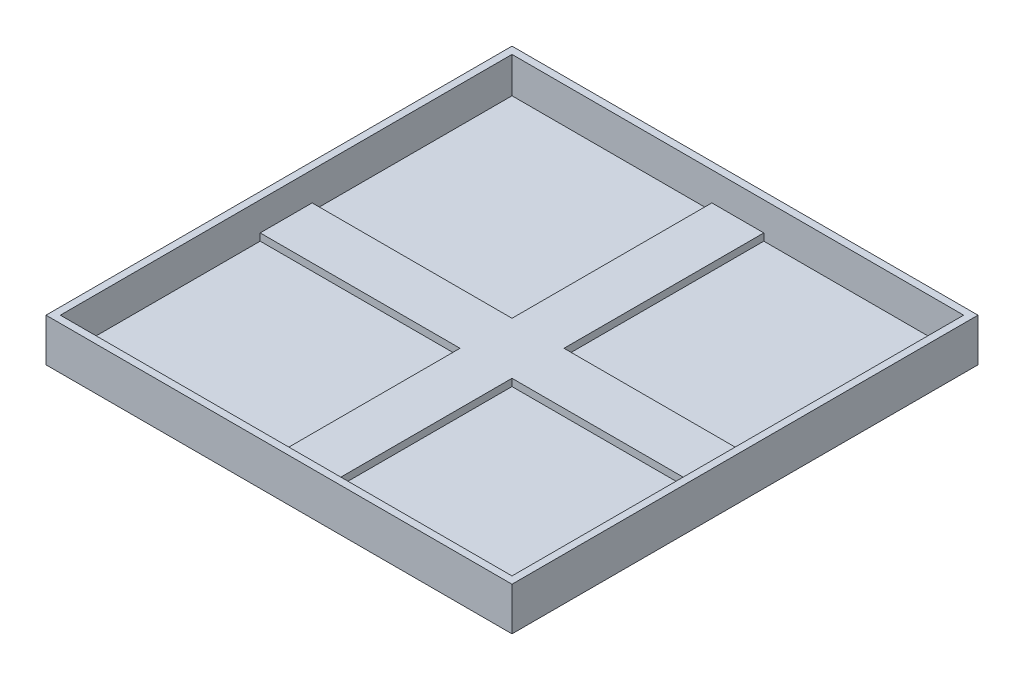
ISO-10303-21;
HEADER;
FILE_DESCRIPTION(('STEP AP214'),'2;1');
FILE_NAME('part.step','',(''),(''),'','','');
FILE_SCHEMA(('AUTOMOTIVE_DESIGN { 1 0 10303 214 1 1 1 1 }'));
ENDSEC;
DATA;
#1=APPLICATION_CONTEXT('core data for automotive mechanical design processes');
#2=APPLICATION_PROTOCOL_DEFINITION('international standard','automotive_design',2000,#1);
#3=PRODUCT_CONTEXT('',#1,'mechanical');
#4=PRODUCT('Part','Part','',(#3));
#5=PRODUCT_RELATED_PRODUCT_CATEGORY('part','',(#4));
#6=PRODUCT_DEFINITION_FORMATION('','',#4);
#7=PRODUCT_DEFINITION_CONTEXT('part definition',#1,'design');
#8=PRODUCT_DEFINITION('design','',#6,#7);
#9=PRODUCT_DEFINITION_SHAPE('','',#8);
#10=(LENGTH_UNIT() NAMED_UNIT(*) SI_UNIT(.MILLI.,.METRE.));
#11=(NAMED_UNIT(*) PLANE_ANGLE_UNIT() SI_UNIT($,.RADIAN.));
#12=(NAMED_UNIT(*) SI_UNIT($,.STERADIAN.) SOLID_ANGLE_UNIT());
#13=UNCERTAINTY_MEASURE_WITH_UNIT(LENGTH_MEASURE(1.E-05),#10,'distance_accuracy_value','');
#14=(GEOMETRIC_REPRESENTATION_CONTEXT(3) GLOBAL_UNCERTAINTY_ASSIGNED_CONTEXT((#13)) GLOBAL_UNIT_ASSIGNED_CONTEXT((#10,
#11,#12)) REPRESENTATION_CONTEXT('',''));
#15=CARTESIAN_POINT('',(0.,0.,0.));
#16=DIRECTION('',(0.,0.,1.));
#17=DIRECTION('',(1.,0.,0.));
#18=AXIS2_PLACEMENT_3D('',#15,#16,#17);
#19=CARTESIAN_POINT('',(0.,4.,0.));
#20=DIRECTION('',(0.,1.,0.));
#21=DIRECTION('',(0.,0.,1.));
#22=AXIS2_PLACEMENT_3D('',#19,#20,#21);
#23=PLANE('',#22);
#24=DIRECTION('',(0.,0.,1.));
#25=VECTOR('',#24,1.);
#26=CARTESIAN_POINT('',(126.,4.,0.));
#27=LINE('',#26,#25);
#28=CARTESIAN_POINT('',(126.,4.,14.5));
#29=VERTEX_POINT('',#28);
#30=CARTESIAN_POINT('',(126.,4.,126.));
#31=VERTEX_POINT('',#30);
#32=EDGE_CURVE('E53',#29,#31,#27,.T.);
#33=ORIENTED_EDGE('',*,*,#32,.F.);
#34=DIRECTION('',(-1.,0.,0.));
#35=VECTOR('',#34,1.);
#36=CARTESIAN_POINT('',(0.,4.,14.5));
#37=LINE('',#36,#35);
#38=CARTESIAN_POINT('',(14.5,4.,14.5));
#39=VERTEX_POINT('',#38);
#40=EDGE_CURVE('E168',#29,#39,#37,.T.);
#41=ORIENTED_EDGE('',*,*,#40,.T.);
#42=DIRECTION('',(0.,0.,1.));
#43=VECTOR('',#42,1.);
#44=CARTESIAN_POINT('',(14.5,4.,0.));
#45=LINE('',#44,#43);
#46=CARTESIAN_POINT('',(14.5,4.,126.));
#47=VERTEX_POINT('',#46);
#48=EDGE_CURVE('E165',#39,#47,#45,.T.);
#49=ORIENTED_EDGE('',*,*,#48,.T.);
#50=DIRECTION('',(-1.,0.,0.));
#51=VECTOR('',#50,1.);
#52=CARTESIAN_POINT('',(0.,4.,126.));
#53=LINE('',#52,#51);
#54=EDGE_CURVE('E203',#31,#47,#53,.T.);
#55=ORIENTED_EDGE('',*,*,#54,.F.);
#56=EDGE_LOOP('',(#33,#41,#49,#55));
#57=FACE_BOUND('',#56,.T.);
#58=ADVANCED_FACE('F45',(#57),#23,.T.);
#59=DIRECTION('',(0.,0.,1.));
#60=VECTOR('',#59,1.);
#61=CARTESIAN_POINT('',(-14.5,4.,0.));
#62=LINE('',#61,#60);
#63=CARTESIAN_POINT('',(-14.5,4.,14.5));
#64=VERTEX_POINT('',#63);
#65=CARTESIAN_POINT('',(-14.5,4.,126.));
#66=VERTEX_POINT('',#65);
#67=EDGE_CURVE('E162',#64,#66,#62,.T.);
#68=ORIENTED_EDGE('',*,*,#67,.F.);
#69=DIRECTION('',(-1.,0.,0.));
#70=VECTOR('',#69,1.);
#71=CARTESIAN_POINT('',(0.,4.,14.5));
#72=LINE('',#71,#70);
#73=CARTESIAN_POINT('',(-126.,4.,14.5));
#74=VERTEX_POINT('',#73);
#75=EDGE_CURVE('E159',#64,#74,#72,.T.);
#76=ORIENTED_EDGE('',*,*,#75,.T.);
#77=DIRECTION('',(0.,0.,1.));
#78=VECTOR('',#77,1.);
#79=CARTESIAN_POINT('',(-126.,4.,0.));
#80=LINE('',#79,#78);
#81=CARTESIAN_POINT('',(-126.,4.,126.));
#82=VERTEX_POINT('',#81);
#83=EDGE_CURVE('E199',#74,#82,#80,.T.);
#84=ORIENTED_EDGE('',*,*,#83,.T.);
#85=EDGE_CURVE('E202',#66,#82,#53,.T.);
#86=ORIENTED_EDGE('',*,*,#85,.F.);
#87=EDGE_LOOP('',(#68,#76,#84,#86));
#88=FACE_BOUND('',#87,.T.);
#89=ADVANCED_FACE('F245',(#88),#23,.T.);
#90=DIRECTION('',(-1.,0.,0.));
#91=VECTOR('',#90,1.);
#92=CARTESIAN_POINT('',(0.,4.,-14.5));
#93=LINE('',#92,#91);
#94=CARTESIAN_POINT('',(-14.5,4.,-14.5));
#95=VERTEX_POINT('',#94);
#96=CARTESIAN_POINT('',(-126.,4.,-14.5));
#97=VERTEX_POINT('',#96);
#98=EDGE_CURVE('E157',#95,#97,#93,.T.);
#99=ORIENTED_EDGE('',*,*,#98,.F.);
#100=DIRECTION('',(0.,0.,1.));
#101=VECTOR('',#100,1.);
#102=CARTESIAN_POINT('',(-14.5,4.,0.));
#103=LINE('',#102,#101);
#104=CARTESIAN_POINT('',(-14.5,4.,-126.));
#105=VERTEX_POINT('',#104);
#106=EDGE_CURVE('E120',#105,#95,#103,.T.);
#107=ORIENTED_EDGE('',*,*,#106,.F.);
#108=DIRECTION('',(-1.,0.,0.));
#109=VECTOR('',#108,1.);
#110=CARTESIAN_POINT('',(0.,4.,-126.));
#111=LINE('',#110,#109);
#112=CARTESIAN_POINT('',(-126.,4.,-126.));
#113=VERTEX_POINT('',#112);
#114=EDGE_CURVE('E195',#105,#113,#111,.T.);
#115=ORIENTED_EDGE('',*,*,#114,.T.);
#116=EDGE_CURVE('E200',#113,#97,#80,.T.);
#117=ORIENTED_EDGE('',*,*,#116,.T.);
#118=EDGE_LOOP('',(#99,#107,#115,#117));
#119=FACE_BOUND('',#118,.T.);
#120=ADVANCED_FACE('F383',(#119),#23,.T.);
#121=DIRECTION('',(-1.,0.,0.));
#122=VECTOR('',#121,1.);
#123=CARTESIAN_POINT('',(0.,4.,-14.5));
#124=LINE('',#123,#122);
#125=CARTESIAN_POINT('',(126.,4.,-14.5));
#126=VERTEX_POINT('',#125);
#127=CARTESIAN_POINT('',(14.5,4.,-14.5));
#128=VERTEX_POINT('',#127);
#129=EDGE_CURVE('E60',#126,#128,#124,.T.);
#130=ORIENTED_EDGE('',*,*,#129,.F.);
#131=CARTESIAN_POINT('',(126.,4.,-126.));
#132=VERTEX_POINT('',#131);
#133=EDGE_CURVE('E11',#132,#126,#27,.T.);
#134=ORIENTED_EDGE('',*,*,#133,.F.);
#135=CARTESIAN_POINT('',(14.5,4.,-126.));
#136=VERTEX_POINT('',#135);
#137=EDGE_CURVE('E196',#132,#136,#111,.T.);
#138=ORIENTED_EDGE('',*,*,#137,.T.);
#139=DIRECTION('',(0.,0.,1.));
#140=VECTOR('',#139,1.);
#141=CARTESIAN_POINT('',(14.5,4.,0.));
#142=LINE('',#141,#140);
#143=EDGE_CURVE('E152',#136,#128,#142,.T.);
#144=ORIENTED_EDGE('',*,*,#143,.T.);
#145=EDGE_LOOP('',(#130,#134,#138,#144));
#146=FACE_BOUND('',#145,.T.);
#147=ADVANCED_FACE('F385',(#146),#23,.T.);
#148=CARTESIAN_POINT('',(0.,8.,-14.5));
#149=DIRECTION('',(0.,0.,1.));
#150=DIRECTION('',(1.,0.,0.));
#151=AXIS2_PLACEMENT_3D('',#148,#149,#150);
#152=PLANE('',#151);
#153=ORIENTED_EDGE('',*,*,#129,.T.);
#154=DIRECTION('',(0.,-1.,0.));
#155=VECTOR('',#154,1.);
#156=CARTESIAN_POINT('',(14.5,8.,-14.5));
#157=LINE('',#156,#155);
#158=CARTESIAN_POINT('',(14.5,8.,-14.5));
#159=VERTEX_POINT('',#158);
#160=EDGE_CURVE('E193',#159,#128,#157,.T.);
#161=ORIENTED_EDGE('',*,*,#160,.F.);
#162=DIRECTION('',(-1.,0.,0.));
#163=VECTOR('',#162,1.);
#164=CARTESIAN_POINT('',(0.,8.,-14.5));
#165=LINE('',#164,#163);
#166=CARTESIAN_POINT('',(126.,8.,-14.5));
#167=VERTEX_POINT('',#166);
#168=EDGE_CURVE('E94',#167,#159,#165,.T.);
#169=ORIENTED_EDGE('',*,*,#168,.F.);
#170=DIRECTION('',(0.,-1.,0.));
#171=VECTOR('',#170,1.);
#172=CARTESIAN_POINT('',(126.,8.,-14.5));
#173=LINE('',#172,#171);
#174=EDGE_CURVE('E150',#167,#126,#173,.T.);
#175=ORIENTED_EDGE('',*,*,#174,.T.);
#176=EDGE_LOOP('',(#153,#161,#169,#175));
#177=FACE_BOUND('',#176,.T.);
#178=ADVANCED_FACE('F390',(#177),#152,.F.);
#179=CARTESIAN_POINT('',(14.5,8.,0.));
#180=DIRECTION('',(1.,0.,0.));
#181=DIRECTION('',(0.,0.,-1.));
#182=AXIS2_PLACEMENT_3D('',#179,#180,#181);
#183=PLANE('',#182);
#184=ORIENTED_EDGE('',*,*,#143,.F.);
#185=DIRECTION('',(0.,-1.,0.));
#186=VECTOR('',#185,1.);
#187=CARTESIAN_POINT('',(14.5,8.,-126.));
#188=LINE('',#187,#186);
#189=CARTESIAN_POINT('',(14.5,8.,-126.));
#190=VERTEX_POINT('',#189);
#191=EDGE_CURVE('E190',#190,#136,#188,.T.);
#192=ORIENTED_EDGE('',*,*,#191,.F.);
#193=DIRECTION('',(0.,0.,1.));
#194=VECTOR('',#193,1.);
#195=CARTESIAN_POINT('',(14.5,8.,0.));
#196=LINE('',#195,#194);
#197=EDGE_CURVE('E376',#190,#159,#196,.T.);
#198=ORIENTED_EDGE('',*,*,#197,.T.);
#199=ORIENTED_EDGE('',*,*,#160,.T.);
#200=EDGE_LOOP('',(#184,#192,#198,#199));
#201=FACE_BOUND('',#200,.T.);
#202=ADVANCED_FACE('F381',(#201),#183,.T.);
#203=CARTESIAN_POINT('',(-14.5,8.,0.));
#204=DIRECTION('',(1.,0.,0.));
#205=DIRECTION('',(0.,0.,-1.));
#206=AXIS2_PLACEMENT_3D('',#203,#204,#205);
#207=PLANE('',#206);
#208=ORIENTED_EDGE('',*,*,#106,.T.);
#209=DIRECTION('',(0.,-1.,0.));
#210=VECTOR('',#209,1.);
#211=CARTESIAN_POINT('',(-14.5,8.,-14.5));
#212=LINE('',#211,#210);
#213=CARTESIAN_POINT('',(-14.5,8.,-14.5));
#214=VERTEX_POINT('',#213);
#215=EDGE_CURVE('E117',#214,#95,#212,.T.);
#216=ORIENTED_EDGE('',*,*,#215,.F.);
#217=DIRECTION('',(0.,0.,1.));
#218=VECTOR('',#217,1.);
#219=CARTESIAN_POINT('',(-14.5,8.,0.));
#220=LINE('',#219,#218);
#221=CARTESIAN_POINT('',(-14.5,8.,-126.));
#222=VERTEX_POINT('',#221);
#223=EDGE_CURVE('E103',#222,#214,#220,.T.);
#224=ORIENTED_EDGE('',*,*,#223,.F.);
#225=DIRECTION('',(0.,-1.,0.));
#226=VECTOR('',#225,1.);
#227=CARTESIAN_POINT('',(-14.5,8.,-126.));
#228=LINE('',#227,#226);
#229=EDGE_CURVE('E124',#222,#105,#228,.T.);
#230=ORIENTED_EDGE('',*,*,#229,.T.);
#231=EDGE_LOOP('',(#208,#216,#224,#230));
#232=FACE_BOUND('',#231,.T.);
#233=ADVANCED_FACE('F118',(#232),#207,.F.);
#234=CARTESIAN_POINT('',(0.,8.,-14.5));
#235=DIRECTION('',(0.,0.,1.));
#236=DIRECTION('',(1.,0.,0.));
#237=AXIS2_PLACEMENT_3D('',#234,#235,#236);
#238=PLANE('',#237);
#239=ORIENTED_EDGE('',*,*,#98,.T.);
#240=DIRECTION('',(0.,-1.,0.));
#241=VECTOR('',#240,1.);
#242=CARTESIAN_POINT('',(-126.,8.,-14.5));
#243=LINE('',#242,#241);
#244=CARTESIAN_POINT('',(-126.,8.,-14.5));
#245=VERTEX_POINT('',#244);
#246=EDGE_CURVE('E125',#245,#97,#243,.T.);
#247=ORIENTED_EDGE('',*,*,#246,.F.);
#248=DIRECTION('',(-1.,0.,0.));
#249=VECTOR('',#248,1.);
#250=CARTESIAN_POINT('',(0.,8.,-14.5));
#251=LINE('',#250,#249);
#252=EDGE_CURVE('E109',#214,#245,#251,.T.);
#253=ORIENTED_EDGE('',*,*,#252,.F.);
#254=ORIENTED_EDGE('',*,*,#215,.T.);
#255=EDGE_LOOP('',(#239,#247,#253,#254));
#256=FACE_BOUND('',#255,.T.);
#257=ADVANCED_FACE('F127',(#256),#238,.F.);
#258=CARTESIAN_POINT('',(0.,8.,14.5));
#259=DIRECTION('',(0.,0.,1.));
#260=DIRECTION('',(1.,0.,0.));
#261=AXIS2_PLACEMENT_3D('',#258,#259,#260);
#262=PLANE('',#261);
#263=ORIENTED_EDGE('',*,*,#75,.F.);
#264=DIRECTION('',(0.,-1.,0.));
#265=VECTOR('',#264,1.);
#266=CARTESIAN_POINT('',(-14.5,8.,14.5));
#267=LINE('',#266,#265);
#268=CARTESIAN_POINT('',(-14.5,8.,14.5));
#269=VERTEX_POINT('',#268);
#270=EDGE_CURVE('E183',#269,#64,#267,.T.);
#271=ORIENTED_EDGE('',*,*,#270,.F.);
#272=DIRECTION('',(-1.,0.,0.));
#273=VECTOR('',#272,1.);
#274=CARTESIAN_POINT('',(0.,8.,14.5));
#275=LINE('',#274,#273);
#276=CARTESIAN_POINT('',(-126.,8.,14.5));
#277=VERTEX_POINT('',#276);
#278=EDGE_CURVE('E131',#269,#277,#275,.T.);
#279=ORIENTED_EDGE('',*,*,#278,.T.);
#280=DIRECTION('',(0.,-1.,0.));
#281=VECTOR('',#280,1.);
#282=CARTESIAN_POINT('',(-126.,8.,14.5));
#283=LINE('',#282,#281);
#284=EDGE_CURVE('E185',#277,#74,#283,.T.);
#285=ORIENTED_EDGE('',*,*,#284,.T.);
#286=EDGE_LOOP('',(#263,#271,#279,#285));
#287=FACE_BOUND('',#286,.T.);
#288=ADVANCED_FACE('F249',(#287),#262,.T.);
#289=CARTESIAN_POINT('',(-14.5,8.,0.));
#290=DIRECTION('',(1.,0.,0.));
#291=DIRECTION('',(0.,0.,-1.));
#292=AXIS2_PLACEMENT_3D('',#289,#290,#291);
#293=PLANE('',#292);
#294=ORIENTED_EDGE('',*,*,#67,.T.);
#295=DIRECTION('',(0.,-1.,0.));
#296=VECTOR('',#295,1.);
#297=CARTESIAN_POINT('',(-14.5,8.,126.));
#298=LINE('',#297,#296);
#299=CARTESIAN_POINT('',(-14.5,8.,126.));
#300=VERTEX_POINT('',#299);
#301=EDGE_CURVE('E180',#300,#66,#298,.T.);
#302=ORIENTED_EDGE('',*,*,#301,.F.);
#303=DIRECTION('',(0.,0.,1.));
#304=VECTOR('',#303,1.);
#305=CARTESIAN_POINT('',(-14.5,8.,0.));
#306=LINE('',#305,#304);
#307=EDGE_CURVE('E137',#269,#300,#306,.T.);
#308=ORIENTED_EDGE('',*,*,#307,.F.);
#309=ORIENTED_EDGE('',*,*,#270,.T.);
#310=EDGE_LOOP('',(#294,#302,#308,#309));
#311=FACE_BOUND('',#310,.T.);
#312=ADVANCED_FACE('F257',(#311),#293,.F.);
#313=CARTESIAN_POINT('',(14.5,8.,0.));
#314=DIRECTION('',(1.,0.,0.));
#315=DIRECTION('',(0.,0.,-1.));
#316=AXIS2_PLACEMENT_3D('',#313,#314,#315);
#317=PLANE('',#316);
#318=ORIENTED_EDGE('',*,*,#48,.F.);
#319=DIRECTION('',(0.,-1.,0.));
#320=VECTOR('',#319,1.);
#321=CARTESIAN_POINT('',(14.5,8.,14.5));
#322=LINE('',#321,#320);
#323=CARTESIAN_POINT('',(14.5,8.,14.5));
#324=VERTEX_POINT('',#323);
#325=EDGE_CURVE('E69',#324,#39,#322,.T.);
#326=ORIENTED_EDGE('',*,*,#325,.F.);
#327=DIRECTION('',(0.,0.,1.));
#328=VECTOR('',#327,1.);
#329=CARTESIAN_POINT('',(14.5,8.,0.));
#330=LINE('',#329,#328);
#331=CARTESIAN_POINT('',(14.5,8.,126.));
#332=VERTEX_POINT('',#331);
#333=EDGE_CURVE('E143',#324,#332,#330,.T.);
#334=ORIENTED_EDGE('',*,*,#333,.T.);
#335=DIRECTION('',(0.,-1.,0.));
#336=VECTOR('',#335,1.);
#337=CARTESIAN_POINT('',(14.5,8.,126.));
#338=LINE('',#337,#336);
#339=EDGE_CURVE('E177',#332,#47,#338,.T.);
#340=ORIENTED_EDGE('',*,*,#339,.T.);
#341=EDGE_LOOP('',(#318,#326,#334,#340));
#342=FACE_BOUND('',#341,.T.);
#343=ADVANCED_FACE('F416',(#342),#317,.T.);
#344=CARTESIAN_POINT('',(0.,8.,14.5));
#345=DIRECTION('',(0.,0.,1.));
#346=DIRECTION('',(1.,0.,0.));
#347=AXIS2_PLACEMENT_3D('',#344,#345,#346);
#348=PLANE('',#347);
#349=ORIENTED_EDGE('',*,*,#40,.F.);
#350=DIRECTION('',(0.,-1.,0.));
#351=VECTOR('',#350,1.);
#352=CARTESIAN_POINT('',(126.,8.,14.5));
#353=LINE('',#352,#351);
#354=CARTESIAN_POINT('',(126.,8.,14.5));
#355=VERTEX_POINT('',#354);
#356=EDGE_CURVE('E173',#355,#29,#353,.T.);
#357=ORIENTED_EDGE('',*,*,#356,.F.);
#358=DIRECTION('',(-1.,0.,0.));
#359=VECTOR('',#358,1.);
#360=CARTESIAN_POINT('',(0.,8.,14.5));
#361=LINE('',#360,#359);
#362=EDGE_CURVE('E145',#355,#324,#361,.T.);
#363=ORIENTED_EDGE('',*,*,#362,.T.);
#364=ORIENTED_EDGE('',*,*,#325,.T.);
#365=EDGE_LOOP('',(#349,#357,#363,#364));
#366=FACE_BOUND('',#365,.T.);
#367=ADVANCED_FACE('F419',(#366),#348,.T.);
#368=CARTESIAN_POINT('',(0.,8.,0.));
#369=DIRECTION('',(0.,1.,0.));
#370=DIRECTION('',(0.,0.,1.));
#371=AXIS2_PLACEMENT_3D('',#368,#369,#370);
#372=PLANE('',#371);
#373=ORIENTED_EDGE('',*,*,#168,.T.);
#374=ORIENTED_EDGE('',*,*,#197,.F.);
#375=DIRECTION('',(-1.,0.,0.));
#376=VECTOR('',#375,1.);
#377=CARTESIAN_POINT('',(0.,8.,-126.));
#378=LINE('',#377,#376);
#379=EDGE_CURVE('E112',#190,#222,#378,.T.);
#380=ORIENTED_EDGE('',*,*,#379,.T.);
#381=ORIENTED_EDGE('',*,*,#223,.T.);
#382=ORIENTED_EDGE('',*,*,#252,.T.);
#383=DIRECTION('',(0.,0.,1.));
#384=VECTOR('',#383,1.);
#385=CARTESIAN_POINT('',(-126.,8.,0.));
#386=LINE('',#385,#384);
#387=EDGE_CURVE('E129',#245,#277,#386,.T.);
#388=ORIENTED_EDGE('',*,*,#387,.T.);
#389=ORIENTED_EDGE('',*,*,#278,.F.);
#390=ORIENTED_EDGE('',*,*,#307,.T.);
#391=DIRECTION('',(1.,0.,0.));
#392=VECTOR('',#391,1.);
#393=CARTESIAN_POINT('',(0.,8.,126.));
#394=LINE('',#393,#392);
#395=EDGE_CURVE('E140',#300,#332,#394,.T.);
#396=ORIENTED_EDGE('',*,*,#395,.T.);
#397=ORIENTED_EDGE('',*,*,#333,.F.);
#398=ORIENTED_EDGE('',*,*,#362,.F.);
#399=DIRECTION('',(0.,0.,-1.));
#400=VECTOR('',#399,1.);
#401=CARTESIAN_POINT('',(126.,8.,0.));
#402=LINE('',#401,#400);
#403=EDGE_CURVE('E148',#355,#167,#402,.T.);
#404=ORIENTED_EDGE('',*,*,#403,.T.);
#405=EDGE_LOOP('',(#373,#374,#380,#381,#382,#388,#389,#390,#396,#397,#398,#404));
#406=FACE_BOUND('',#405,.T.);
#407=ADVANCED_FACE('F105',(#406),#372,.T.);
#408=CARTESIAN_POINT('',(130.,24.,130.));
#409=DIRECTION('',(0.,0.,1.));
#410=DIRECTION('',(1.,0.,0.));
#411=AXIS2_PLACEMENT_3D('',#408,#409,#410);
#412=PLANE('',#411);
#413=DIRECTION('',(-1.,0.,0.));
#414=VECTOR('',#413,1.);
#415=CARTESIAN_POINT('',(130.,0.,130.));
#416=LINE('',#415,#414);
#417=CARTESIAN_POINT('',(130.,0.,130.));
#418=VERTEX_POINT('',#417);
#419=CARTESIAN_POINT('',(-130.,0.,130.));
#420=VERTEX_POINT('',#419);
#421=EDGE_CURVE('E242',#418,#420,#416,.T.);
#422=ORIENTED_EDGE('',*,*,#421,.F.);
#423=DIRECTION('',(0.,-1.,0.));
#424=VECTOR('',#423,1.);
#425=CARTESIAN_POINT('',(130.,24.,130.));
#426=LINE('',#425,#424);
#427=CARTESIAN_POINT('',(130.,24.,130.));
#428=VERTEX_POINT('',#427);
#429=EDGE_CURVE('E153',#428,#418,#426,.T.);
#430=ORIENTED_EDGE('',*,*,#429,.F.);
#431=DIRECTION('',(-1.,0.,0.));
#432=VECTOR('',#431,1.);
#433=CARTESIAN_POINT('',(130.,24.,130.));
#434=LINE('',#433,#432);
#435=CARTESIAN_POINT('',(-130.,24.,130.));
#436=VERTEX_POINT('',#435);
#437=EDGE_CURVE('E344',#428,#436,#434,.T.);
#438=ORIENTED_EDGE('',*,*,#437,.T.);
#439=DIRECTION('',(0.,-1.,0.));
#440=VECTOR('',#439,1.);
#441=CARTESIAN_POINT('',(-130.,24.,130.));
#442=LINE('',#441,#440);
#443=EDGE_CURVE('E358',#436,#420,#442,.T.);
#444=ORIENTED_EDGE('',*,*,#443,.T.);
#445=EDGE_LOOP('',(#422,#430,#438,#444));
#446=FACE_BOUND('',#445,.T.);
#447=ADVANCED_FACE('F424',(#446),#412,.T.);
#448=CARTESIAN_POINT('',(130.,24.,130.));
#449=DIRECTION('',(1.,0.,0.));
#450=DIRECTION('',(0.,0.,-1.));
#451=AXIS2_PLACEMENT_3D('',#448,#449,#450);
#452=PLANE('',#451);
#453=DIRECTION('',(0.,0.,1.));
#454=VECTOR('',#453,1.);
#455=CARTESIAN_POINT('',(130.,0.,130.));
#456=LINE('',#455,#454);
#457=CARTESIAN_POINT('',(130.,0.,-130.));
#458=VERTEX_POINT('',#457);
#459=EDGE_CURVE('E349',#458,#418,#456,.T.);
#460=ORIENTED_EDGE('',*,*,#459,.F.);
#461=DIRECTION('',(0.,-1.,0.));
#462=VECTOR('',#461,1.);
#463=CARTESIAN_POINT('',(130.,24.,-130.));
#464=LINE('',#463,#462);
#465=CARTESIAN_POINT('',(130.,24.,-130.));
#466=VERTEX_POINT('',#465);
#467=EDGE_CURVE('E370',#466,#458,#464,.T.);
#468=ORIENTED_EDGE('',*,*,#467,.F.);
#469=DIRECTION('',(0.,0.,1.));
#470=VECTOR('',#469,1.);
#471=CARTESIAN_POINT('',(130.,24.,130.));
#472=LINE('',#471,#470);
#473=EDGE_CURVE('E355',#466,#428,#472,.T.);
#474=ORIENTED_EDGE('',*,*,#473,.T.);
#475=ORIENTED_EDGE('',*,*,#429,.T.);
#476=EDGE_LOOP('',(#460,#468,#474,#475));
#477=FACE_BOUND('',#476,.T.);
#478=ADVANCED_FACE('F427',(#477),#452,.T.);
#479=CARTESIAN_POINT('',(130.,24.,-130.));
#480=DIRECTION('',(0.,0.,-1.));
#481=DIRECTION('',(-1.,0.,0.));
#482=AXIS2_PLACEMENT_3D('',#479,#480,#481);
#483=PLANE('',#482);
#484=DIRECTION('',(1.,0.,0.));
#485=VECTOR('',#484,1.);
#486=CARTESIAN_POINT('',(130.,0.,-130.));
#487=LINE('',#486,#485);
#488=CARTESIAN_POINT('',(-130.,0.,-130.));
#489=VERTEX_POINT('',#488);
#490=EDGE_CURVE('E364',#489,#458,#487,.T.);
#491=ORIENTED_EDGE('',*,*,#490,.F.);
#492=DIRECTION('',(0.,-1.,0.));
#493=VECTOR('',#492,1.);
#494=CARTESIAN_POINT('',(-130.,24.,-130.));
#495=LINE('',#494,#493);
#496=CARTESIAN_POINT('',(-130.,24.,-130.));
#497=VERTEX_POINT('',#496);
#498=EDGE_CURVE('E372',#497,#489,#495,.T.);
#499=ORIENTED_EDGE('',*,*,#498,.F.);
#500=DIRECTION('',(1.,0.,0.));
#501=VECTOR('',#500,1.);
#502=CARTESIAN_POINT('',(130.,24.,-130.));
#503=LINE('',#502,#501);
#504=EDGE_CURVE('E352',#497,#466,#503,.T.);
#505=ORIENTED_EDGE('',*,*,#504,.T.);
#506=ORIENTED_EDGE('',*,*,#467,.T.);
#507=EDGE_LOOP('',(#491,#499,#505,#506));
#508=FACE_BOUND('',#507,.T.);
#509=ADVANCED_FACE('F432',(#508),#483,.T.);
#510=CARTESIAN_POINT('',(-130.,24.,130.));
#511=DIRECTION('',(-1.,0.,0.));
#512=DIRECTION('',(0.,0.,1.));
#513=AXIS2_PLACEMENT_3D('',#510,#511,#512);
#514=PLANE('',#513);
#515=DIRECTION('',(0.,0.,-1.));
#516=VECTOR('',#515,1.);
#517=CARTESIAN_POINT('',(-130.,0.,130.));
#518=LINE('',#517,#516);
#519=EDGE_CURVE('E361',#420,#489,#518,.T.);
#520=ORIENTED_EDGE('',*,*,#519,.F.);
#521=ORIENTED_EDGE('',*,*,#443,.F.);
#522=DIRECTION('',(0.,0.,-1.));
#523=VECTOR('',#522,1.);
#524=CARTESIAN_POINT('',(-130.,24.,130.));
#525=LINE('',#524,#523);
#526=EDGE_CURVE('E348',#436,#497,#525,.T.);
#527=ORIENTED_EDGE('',*,*,#526,.T.);
#528=ORIENTED_EDGE('',*,*,#498,.T.);
#529=EDGE_LOOP('',(#520,#521,#527,#528));
#530=FACE_BOUND('',#529,.T.);
#531=ADVANCED_FACE('F429',(#530),#514,.T.);
#532=CARTESIAN_POINT('',(0.,24.,0.));
#533=DIRECTION('',(0.,-1.,0.));
#534=DIRECTION('',(0.,0.,-1.));
#535=AXIS2_PLACEMENT_3D('',#532,#533,#534);
#536=PLANE('',#535);
#537=DIRECTION('',(-1.,0.,0.));
#538=VECTOR('',#537,1.);
#539=CARTESIAN_POINT('',(126.,24.,126.));
#540=LINE('',#539,#538);
#541=CARTESIAN_POINT('',(126.,24.,126.));
#542=VERTEX_POINT('',#541);
#543=CARTESIAN_POINT('',(-126.,24.,126.));
#544=VERTEX_POINT('',#543);
#545=EDGE_CURVE('E325',#542,#544,#540,.T.);
#546=ORIENTED_EDGE('',*,*,#545,.T.);
#547=DIRECTION('',(0.,0.,-1.));
#548=VECTOR('',#547,1.);
#549=CARTESIAN_POINT('',(-126.,24.,126.));
#550=LINE('',#549,#548);
#551=CARTESIAN_POINT('',(-126.,24.,-126.));
#552=VERTEX_POINT('',#551);
#553=EDGE_CURVE('E240',#544,#552,#550,.T.);
#554=ORIENTED_EDGE('',*,*,#553,.T.);
#555=DIRECTION('',(1.,0.,0.));
#556=VECTOR('',#555,1.);
#557=CARTESIAN_POINT('',(126.,24.,-126.));
#558=LINE('',#557,#556);
#559=CARTESIAN_POINT('',(126.,24.,-126.));
#560=VERTEX_POINT('',#559);
#561=EDGE_CURVE('E329',#552,#560,#558,.T.);
#562=ORIENTED_EDGE('',*,*,#561,.T.);
#563=DIRECTION('',(0.,0.,1.));
#564=VECTOR('',#563,1.);
#565=CARTESIAN_POINT('',(126.,24.,126.));
#566=LINE('',#565,#564);
#567=EDGE_CURVE('E334',#560,#542,#566,.T.);
#568=ORIENTED_EDGE('',*,*,#567,.T.);
#569=EDGE_LOOP('',(#546,#554,#562,#568));
#570=FACE_BOUND('',#569,.T.);
#571=ORIENTED_EDGE('',*,*,#437,.F.);
#572=ORIENTED_EDGE('',*,*,#473,.F.);
#573=ORIENTED_EDGE('',*,*,#504,.F.);
#574=ORIENTED_EDGE('',*,*,#526,.F.);
#575=EDGE_LOOP('',(#571,#572,#573,#574));
#576=FACE_BOUND('',#575,.T.);
#577=ADVANCED_FACE('F336',(#570,#576),#536,.F.);
#578=CARTESIAN_POINT('',(-126.,24.,126.));
#579=DIRECTION('',(-1.,0.,0.));
#580=DIRECTION('',(0.,0.,1.));
#581=AXIS2_PLACEMENT_3D('',#578,#579,#580);
#582=PLANE('',#581);
#583=ORIENTED_EDGE('',*,*,#83,.F.);
#584=ORIENTED_EDGE('',*,*,#284,.F.);
#585=ORIENTED_EDGE('',*,*,#387,.F.);
#586=ORIENTED_EDGE('',*,*,#246,.T.);
#587=ORIENTED_EDGE('',*,*,#116,.F.);
#588=DIRECTION('',(0.,-1.,0.));
#589=VECTOR('',#588,1.);
#590=CARTESIAN_POINT('',(-126.,24.,-126.));
#591=LINE('',#590,#589);
#592=EDGE_CURVE('E320',#552,#113,#591,.T.);
#593=ORIENTED_EDGE('',*,*,#592,.F.);
#594=ORIENTED_EDGE('',*,*,#553,.F.);
#595=DIRECTION('',(0.,-1.,0.));
#596=VECTOR('',#595,1.);
#597=CARTESIAN_POINT('',(-126.,24.,126.));
#598=LINE('',#597,#596);
#599=EDGE_CURVE('E222',#544,#82,#598,.T.);
#600=ORIENTED_EDGE('',*,*,#599,.T.);
#601=EDGE_LOOP('',(#583,#584,#585,#586,#587,#593,#594,#600));
#602=FACE_BOUND('',#601,.T.);
#603=ADVANCED_FACE('F235',(#602),#582,.F.);
#604=CARTESIAN_POINT('',(126.,24.,126.));
#605=DIRECTION('',(0.,0.,1.));
#606=DIRECTION('',(1.,0.,0.));
#607=AXIS2_PLACEMENT_3D('',#604,#605,#606);
#608=PLANE('',#607);
#609=ORIENTED_EDGE('',*,*,#54,.T.);
#610=ORIENTED_EDGE('',*,*,#339,.F.);
#611=ORIENTED_EDGE('',*,*,#395,.F.);
#612=ORIENTED_EDGE('',*,*,#301,.T.);
#613=ORIENTED_EDGE('',*,*,#85,.T.);
#614=ORIENTED_EDGE('',*,*,#599,.F.);
#615=ORIENTED_EDGE('',*,*,#545,.F.);
#616=DIRECTION('',(0.,-1.,0.));
#617=VECTOR('',#616,1.);
#618=CARTESIAN_POINT('',(126.,24.,126.));
#619=LINE('',#618,#617);
#620=EDGE_CURVE('E243',#542,#31,#619,.T.);
#621=ORIENTED_EDGE('',*,*,#620,.T.);
#622=EDGE_LOOP('',(#609,#610,#611,#612,#613,#614,#615,#621));
#623=FACE_BOUND('',#622,.T.);
#624=ADVANCED_FACE('F219',(#623),#608,.F.);
#625=CARTESIAN_POINT('',(126.,24.,126.));
#626=DIRECTION('',(1.,0.,0.));
#627=DIRECTION('',(0.,0.,-1.));
#628=AXIS2_PLACEMENT_3D('',#625,#626,#627);
#629=PLANE('',#628);
#630=ORIENTED_EDGE('',*,*,#32,.T.);
#631=ORIENTED_EDGE('',*,*,#620,.F.);
#632=ORIENTED_EDGE('',*,*,#567,.F.);
#633=DIRECTION('',(0.,-1.,0.));
#634=VECTOR('',#633,1.);
#635=CARTESIAN_POINT('',(126.,24.,-126.));
#636=LINE('',#635,#634);
#637=EDGE_CURVE('E324',#560,#132,#636,.T.);
#638=ORIENTED_EDGE('',*,*,#637,.T.);
#639=ORIENTED_EDGE('',*,*,#133,.T.);
#640=ORIENTED_EDGE('',*,*,#174,.F.);
#641=ORIENTED_EDGE('',*,*,#403,.F.);
#642=ORIENTED_EDGE('',*,*,#356,.T.);
#643=EDGE_LOOP('',(#630,#631,#632,#638,#639,#640,#641,#642));
#644=FACE_BOUND('',#643,.T.);
#645=ADVANCED_FACE('F399',(#644),#629,.F.);
#646=CARTESIAN_POINT('',(126.,24.,-126.));
#647=DIRECTION('',(0.,0.,-1.));
#648=DIRECTION('',(-1.,0.,0.));
#649=AXIS2_PLACEMENT_3D('',#646,#647,#648);
#650=PLANE('',#649);
#651=ORIENTED_EDGE('',*,*,#114,.F.);
#652=ORIENTED_EDGE('',*,*,#229,.F.);
#653=ORIENTED_EDGE('',*,*,#379,.F.);
#654=ORIENTED_EDGE('',*,*,#191,.T.);
#655=ORIENTED_EDGE('',*,*,#137,.F.);
#656=ORIENTED_EDGE('',*,*,#637,.F.);
#657=ORIENTED_EDGE('',*,*,#561,.F.);
#658=ORIENTED_EDGE('',*,*,#592,.T.);
#659=EDGE_LOOP('',(#651,#652,#653,#654,#655,#656,#657,#658));
#660=FACE_BOUND('',#659,.T.);
#661=ADVANCED_FACE('F330',(#660),#650,.F.);
#662=CARTESIAN_POINT('',(0.,0.,0.));
#663=DIRECTION('',(0.,1.,0.));
#664=DIRECTION('',(0.,0.,1.));
#665=AXIS2_PLACEMENT_3D('',#662,#663,#664);
#666=PLANE('',#665);
#667=ORIENTED_EDGE('',*,*,#421,.T.);
#668=ORIENTED_EDGE('',*,*,#519,.T.);
#669=ORIENTED_EDGE('',*,*,#490,.T.);
#670=ORIENTED_EDGE('',*,*,#459,.T.);
#671=EDGE_LOOP('',(#667,#668,#669,#670));
#672=FACE_BOUND('',#671,.T.);
#673=ADVANCED_FACE('F47',(#672),#666,.F.);
#674=CLOSED_SHELL('',(#58,#89,#120,#147,#178,#202,#233,#257,#288,#312,#343,#367,#407,#447,#478,
#509,#531,#577,#603,#624,#645,#661,#673));
#675=MANIFOLD_SOLID_BREP('B2',#674);
#676=ADVANCED_BREP_SHAPE_REPRESENTATION('',(#18,#675),#14);
#677=SHAPE_DEFINITION_REPRESENTATION(#9,#676);
ENDSEC;
END-ISO-10303-21;
